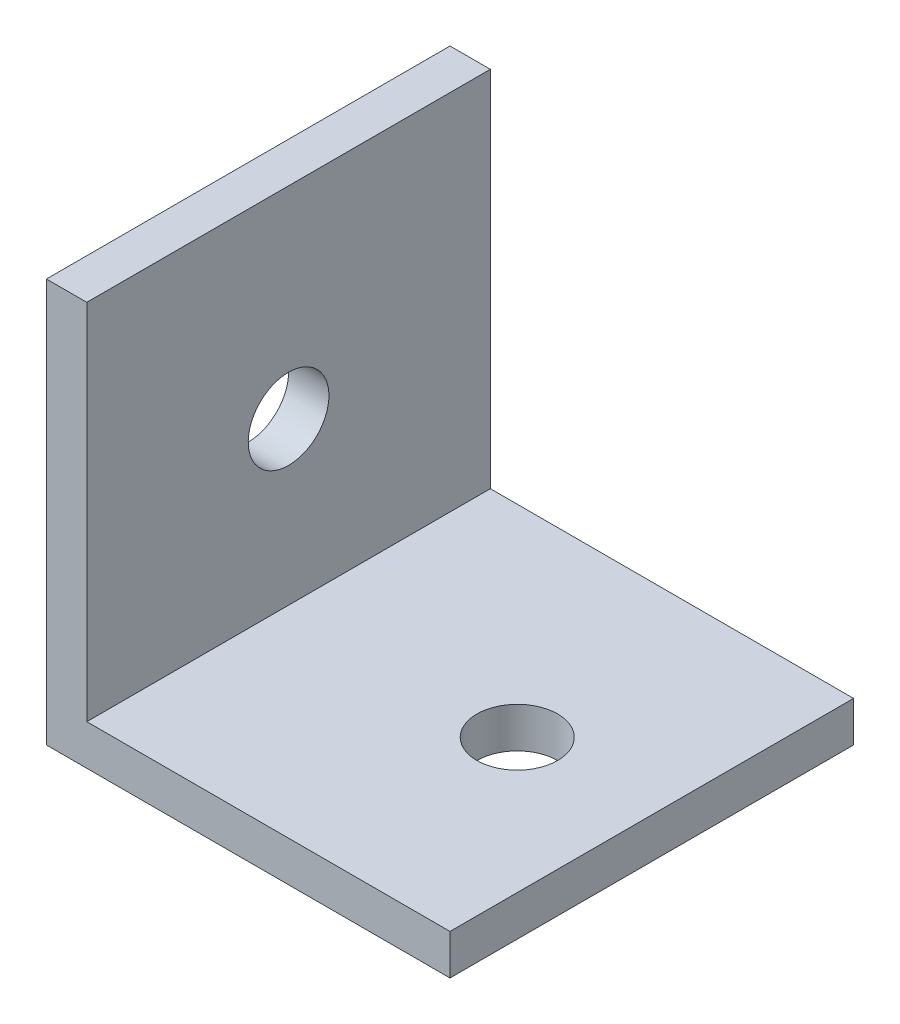
ISO-10303-21;
HEADER;
FILE_DESCRIPTION(('STEP AP214'),'2;1');
FILE_NAME('part.step','',(''),(''),'','','');
FILE_SCHEMA(('AUTOMOTIVE_DESIGN { 1 0 10303 214 1 1 1 1 }'));
ENDSEC;
DATA;
#1=APPLICATION_CONTEXT('core data for automotive mechanical design processes');
#2=APPLICATION_PROTOCOL_DEFINITION('international standard','automotive_design',2000,#1);
#3=PRODUCT_CONTEXT('',#1,'mechanical');
#4=PRODUCT('Part','Part','',(#3));
#5=PRODUCT_RELATED_PRODUCT_CATEGORY('part','',(#4));
#6=PRODUCT_DEFINITION_FORMATION('','',#4);
#7=PRODUCT_DEFINITION_CONTEXT('part definition',#1,'design');
#8=PRODUCT_DEFINITION('design','',#6,#7);
#9=PRODUCT_DEFINITION_SHAPE('','',#8);
#10=(LENGTH_UNIT() NAMED_UNIT(*) SI_UNIT(.MILLI.,.METRE.));
#11=(NAMED_UNIT(*) PLANE_ANGLE_UNIT() SI_UNIT($,.RADIAN.));
#12=(NAMED_UNIT(*) SI_UNIT($,.STERADIAN.) SOLID_ANGLE_UNIT());
#13=UNCERTAINTY_MEASURE_WITH_UNIT(LENGTH_MEASURE(1.E-05),#10,'distance_accuracy_value','');
#14=(GEOMETRIC_REPRESENTATION_CONTEXT(3) GLOBAL_UNCERTAINTY_ASSIGNED_CONTEXT((#13)) GLOBAL_UNIT_ASSIGNED_CONTEXT((#10,
#11,#12)) REPRESENTATION_CONTEXT('',''));
#15=CARTESIAN_POINT('',(0.,0.,0.));
#16=DIRECTION('',(0.,0.,1.));
#17=DIRECTION('',(1.,0.,0.));
#18=AXIS2_PLACEMENT_3D('',#15,#16,#17);
#19=CARTESIAN_POINT('',(-10.4957075667771,-0.631620023269676,15.));
#20=DIRECTION('',(0.,-1.,0.));
#21=DIRECTION('',(1.,0.,0.));
#22=AXIS2_PLACEMENT_3D('',#19,#20,#21);
#23=PLANE('',#22);
#24=DIRECTION('',(-1.,0.,0.));
#25=VECTOR('',#24,1.);
#26=CARTESIAN_POINT('',(-10.4957075667771,-0.631620023269676,0.));
#27=LINE('',#26,#25);
#28=CARTESIAN_POINT('',(-10.4957075667771,-0.631620023269676,0.));
#29=VERTEX_POINT('',#28);
#30=CARTESIAN_POINT('',(-11.9957075667771,-0.631620023269677,0.));
#31=VERTEX_POINT('',#30);
#32=EDGE_CURVE('E117',#29,#31,#27,.T.);
#33=ORIENTED_EDGE('',*,*,#32,.T.);
#34=DIRECTION('',(0.,0.,-1.));
#35=VECTOR('',#34,1.);
#36=CARTESIAN_POINT('',(-11.9957075667771,-0.631620023269677,15.));
#37=LINE('',#36,#35);
#38=CARTESIAN_POINT('',(-11.9957075667771,-0.631620023269677,15.));
#39=VERTEX_POINT('',#38);
#40=EDGE_CURVE('E11',#39,#31,#37,.T.);
#41=ORIENTED_EDGE('',*,*,#40,.F.);
#42=DIRECTION('',(-1.,0.,0.));
#43=VECTOR('',#42,1.);
#44=CARTESIAN_POINT('',(-10.4957075667771,-0.631620023269676,15.));
#45=LINE('',#44,#43);
#46=CARTESIAN_POINT('',(-10.4957075667771,-0.631620023269676,15.));
#47=VERTEX_POINT('',#46);
#48=EDGE_CURVE('E128',#47,#39,#45,.T.);
#49=ORIENTED_EDGE('',*,*,#48,.F.);
#50=DIRECTION('',(0.,0.,-1.));
#51=VECTOR('',#50,1.);
#52=CARTESIAN_POINT('',(-10.4957075667771,-0.631620023269676,15.));
#53=LINE('',#52,#51);
#54=EDGE_CURVE('E113',#47,#29,#53,.T.);
#55=ORIENTED_EDGE('',*,*,#54,.T.);
#56=EDGE_LOOP('',(#33,#41,#49,#55));
#57=FACE_BOUND('',#56,.T.);
#58=ADVANCED_FACE('F31',(#57),#23,.F.);
#59=CARTESIAN_POINT('',(-11.9957075667771,-0.631620023269677,15.));
#60=DIRECTION('',(1.,0.,0.));
#61=DIRECTION('',(0.,1.,0.));
#62=AXIS2_PLACEMENT_3D('',#59,#60,#61);
#63=PLANE('',#62);
#64=CARTESIAN_POINT('',(-11.9957075667771,-8.13162002326968,7.5));
#65=DIRECTION('',(-1.,0.,0.));
#66=DIRECTION('',(0.,-1.,0.));
#67=AXIS2_PLACEMENT_3D('',#64,#65,#66);
#68=CIRCLE('',#67,1.5);
#69=CARTESIAN_POINT('',(-11.9957075667771,-9.63162002326968,7.5));
#70=VERTEX_POINT('',#69);
#71=EDGE_CURVE('E134',#70,#70,#68,.T.);
#72=ORIENTED_EDGE('',*,*,#71,.F.);
#73=EDGE_LOOP('',(#72));
#74=FACE_BOUND('',#73,.T.);
#75=DIRECTION('',(0.,-1.,0.));
#76=VECTOR('',#75,1.);
#77=CARTESIAN_POINT('',(-11.9957075667771,-0.631620023269677,0.));
#78=LINE('',#77,#76);
#79=CARTESIAN_POINT('',(-11.9957075667771,-15.6316200232697,0.));
#80=VERTEX_POINT('',#79);
#81=EDGE_CURVE('E120',#31,#80,#78,.T.);
#82=ORIENTED_EDGE('',*,*,#81,.T.);
#83=DIRECTION('',(0.,0.,-1.));
#84=VECTOR('',#83,1.);
#85=CARTESIAN_POINT('',(-11.9957075667771,-15.6316200232697,15.));
#86=LINE('',#85,#84);
#87=CARTESIAN_POINT('',(-11.9957075667771,-15.6316200232697,15.));
#88=VERTEX_POINT('',#87);
#89=EDGE_CURVE('E40',#88,#80,#86,.T.);
#90=ORIENTED_EDGE('',*,*,#89,.F.);
#91=DIRECTION('',(0.,-1.,0.));
#92=VECTOR('',#91,1.);
#93=CARTESIAN_POINT('',(-11.9957075667771,-0.631620023269677,15.));
#94=LINE('',#93,#92);
#95=EDGE_CURVE('E86',#39,#88,#94,.T.);
#96=ORIENTED_EDGE('',*,*,#95,.F.);
#97=ORIENTED_EDGE('',*,*,#40,.T.);
#98=EDGE_LOOP('',(#82,#90,#96,#97));
#99=FACE_BOUND('',#98,.T.);
#100=ADVANCED_FACE('F148',(#74,#99),#63,.F.);
#101=CARTESIAN_POINT('',(-11.9957075667771,-15.6316200232697,15.));
#102=DIRECTION('',(0.,1.,0.));
#103=DIRECTION('',(0.,0.,1.));
#104=AXIS2_PLACEMENT_3D('',#101,#102,#103);
#105=PLANE('',#104);
#106=CARTESIAN_POINT('',(-1.99570756677709,-15.6316200232697,7.5));
#107=DIRECTION('',(0.,-1.,0.));
#108=DIRECTION('',(0.,0.,-1.));
#109=AXIS2_PLACEMENT_3D('',#106,#107,#108);
#110=CIRCLE('',#109,1.5);
#111=CARTESIAN_POINT('',(-1.99570756677709,-15.6316200232697,6.));
#112=VERTEX_POINT('',#111);
#113=EDGE_CURVE('E142',#112,#112,#110,.T.);
#114=ORIENTED_EDGE('',*,*,#113,.F.);
#115=EDGE_LOOP('',(#114));
#116=FACE_BOUND('',#115,.T.);
#117=DIRECTION('',(1.,0.,0.));
#118=VECTOR('',#117,1.);
#119=CARTESIAN_POINT('',(-11.9957075667771,-15.6316200232697,0.));
#120=LINE('',#119,#118);
#121=CARTESIAN_POINT('',(3.00429243322291,-15.6316200232697,0.));
#122=VERTEX_POINT('',#121);
#123=EDGE_CURVE('E123',#80,#122,#120,.T.);
#124=ORIENTED_EDGE('',*,*,#123,.T.);
#125=DIRECTION('',(0.,0.,-1.));
#126=VECTOR('',#125,1.);
#127=CARTESIAN_POINT('',(3.00429243322291,-15.6316200232697,15.));
#128=LINE('',#127,#126);
#129=CARTESIAN_POINT('',(3.00429243322291,-15.6316200232697,15.));
#130=VERTEX_POINT('',#129);
#131=EDGE_CURVE('E108',#130,#122,#128,.T.);
#132=ORIENTED_EDGE('',*,*,#131,.F.);
#133=DIRECTION('',(1.,0.,0.));
#134=VECTOR('',#133,1.);
#135=CARTESIAN_POINT('',(-11.9957075667771,-15.6316200232697,15.));
#136=LINE('',#135,#134);
#137=EDGE_CURVE('E99',#88,#130,#136,.T.);
#138=ORIENTED_EDGE('',*,*,#137,.F.);
#139=ORIENTED_EDGE('',*,*,#89,.T.);
#140=EDGE_LOOP('',(#124,#132,#138,#139));
#141=FACE_BOUND('',#140,.T.);
#142=ADVANCED_FACE('F151',(#116,#141),#105,.F.);
#143=CARTESIAN_POINT('',(3.00429243322291,-15.6316200232697,15.));
#144=DIRECTION('',(-1.,0.,0.));
#145=DIRECTION('',(0.,0.,1.));
#146=AXIS2_PLACEMENT_3D('',#143,#144,#145);
#147=PLANE('',#146);
#148=DIRECTION('',(0.,1.,0.));
#149=VECTOR('',#148,1.);
#150=CARTESIAN_POINT('',(3.00429243322291,-15.6316200232697,0.));
#151=LINE('',#150,#149);
#152=CARTESIAN_POINT('',(3.00429243322291,-14.1316200232697,0.));
#153=VERTEX_POINT('',#152);
#154=EDGE_CURVE('E107',#122,#153,#151,.T.);
#155=ORIENTED_EDGE('',*,*,#154,.T.);
#156=DIRECTION('',(0.,0.,-1.));
#157=VECTOR('',#156,1.);
#158=CARTESIAN_POINT('',(3.00429243322291,-14.1316200232697,15.));
#159=LINE('',#158,#157);
#160=CARTESIAN_POINT('',(3.00429243322291,-14.1316200232697,15.));
#161=VERTEX_POINT('',#160);
#162=EDGE_CURVE('E104',#161,#153,#159,.T.);
#163=ORIENTED_EDGE('',*,*,#162,.F.);
#164=DIRECTION('',(0.,1.,0.));
#165=VECTOR('',#164,1.);
#166=CARTESIAN_POINT('',(3.00429243322291,-15.6316200232697,15.));
#167=LINE('',#166,#165);
#168=EDGE_CURVE('E93',#130,#161,#167,.T.);
#169=ORIENTED_EDGE('',*,*,#168,.F.);
#170=ORIENTED_EDGE('',*,*,#131,.T.);
#171=EDGE_LOOP('',(#155,#163,#169,#170));
#172=FACE_BOUND('',#171,.T.);
#173=ADVANCED_FACE('F105',(#172),#147,.F.);
#174=CARTESIAN_POINT('',(3.00429243322291,-14.1316200232697,15.));
#175=DIRECTION('',(0.,-1.,0.));
#176=DIRECTION('',(1.,0.,0.));
#177=AXIS2_PLACEMENT_3D('',#174,#175,#176);
#178=PLANE('',#177);
#179=CARTESIAN_POINT('',(-1.99570756677709,-14.1316200232697,7.5));
#180=DIRECTION('',(0.,-1.,0.));
#181=DIRECTION('',(1.,0.,0.));
#182=AXIS2_PLACEMENT_3D('',#179,#180,#181);
#183=CIRCLE('',#182,1.5);
#184=CARTESIAN_POINT('',(-0.495707566777091,-14.1316200232697,7.5));
#185=VERTEX_POINT('',#184);
#186=EDGE_CURVE('E34',#185,#185,#183,.T.);
#187=ORIENTED_EDGE('',*,*,#186,.T.);
#188=EDGE_LOOP('',(#187));
#189=FACE_BOUND('',#188,.T.);
#190=DIRECTION('',(-1.,0.,0.));
#191=VECTOR('',#190,1.);
#192=CARTESIAN_POINT('',(3.00429243322291,-14.1316200232697,0.));
#193=LINE('',#192,#191);
#194=CARTESIAN_POINT('',(-10.4957075667771,-14.1316200232697,0.));
#195=VERTEX_POINT('',#194);
#196=EDGE_CURVE('E72',#153,#195,#193,.T.);
#197=ORIENTED_EDGE('',*,*,#196,.T.);
#198=DIRECTION('',(0.,0.,-1.));
#199=VECTOR('',#198,1.);
#200=CARTESIAN_POINT('',(-10.4957075667771,-14.1316200232697,15.));
#201=LINE('',#200,#199);
#202=CARTESIAN_POINT('',(-10.4957075667771,-14.1316200232697,15.));
#203=VERTEX_POINT('',#202);
#204=EDGE_CURVE('E109',#203,#195,#201,.T.);
#205=ORIENTED_EDGE('',*,*,#204,.F.);
#206=DIRECTION('',(-1.,0.,0.));
#207=VECTOR('',#206,1.);
#208=CARTESIAN_POINT('',(3.00429243322291,-14.1316200232697,15.));
#209=LINE('',#208,#207);
#210=EDGE_CURVE('E97',#161,#203,#209,.T.);
#211=ORIENTED_EDGE('',*,*,#210,.F.);
#212=ORIENTED_EDGE('',*,*,#162,.T.);
#213=EDGE_LOOP('',(#197,#205,#211,#212));
#214=FACE_BOUND('',#213,.T.);
#215=ADVANCED_FACE('F111',(#189,#214),#178,.F.);
#216=CARTESIAN_POINT('',(-10.4957075667771,-14.1316200232697,15.));
#217=DIRECTION('',(-1.,0.,0.));
#218=DIRECTION('',(0.,-1.,0.));
#219=AXIS2_PLACEMENT_3D('',#216,#217,#218);
#220=PLANE('',#219);
#221=CARTESIAN_POINT('',(-10.4957075667771,-8.13162002326968,7.5));
#222=DIRECTION('',(-1.,0.,0.));
#223=DIRECTION('',(0.,-1.,0.));
#224=AXIS2_PLACEMENT_3D('',#221,#222,#223);
#225=CIRCLE('',#224,1.5);
#226=CARTESIAN_POINT('',(-10.4957075667771,-9.63162002326968,7.5));
#227=VERTEX_POINT('',#226);
#228=EDGE_CURVE('E121',#227,#227,#225,.T.);
#229=ORIENTED_EDGE('',*,*,#228,.T.);
#230=EDGE_LOOP('',(#229));
#231=FACE_BOUND('',#230,.T.);
#232=DIRECTION('',(0.,1.,0.));
#233=VECTOR('',#232,1.);
#234=CARTESIAN_POINT('',(-10.4957075667771,-14.1316200232697,0.));
#235=LINE('',#234,#233);
#236=EDGE_CURVE('E78',#195,#29,#235,.T.);
#237=ORIENTED_EDGE('',*,*,#236,.T.);
#238=ORIENTED_EDGE('',*,*,#54,.F.);
#239=DIRECTION('',(0.,1.,0.));
#240=VECTOR('',#239,1.);
#241=CARTESIAN_POINT('',(-10.4957075667771,-14.1316200232697,15.));
#242=LINE('',#241,#240);
#243=EDGE_CURVE('E49',#203,#47,#242,.T.);
#244=ORIENTED_EDGE('',*,*,#243,.F.);
#245=ORIENTED_EDGE('',*,*,#204,.T.);
#246=EDGE_LOOP('',(#237,#238,#244,#245));
#247=FACE_BOUND('',#246,.T.);
#248=ADVANCED_FACE('F156',(#231,#247),#220,.F.);
#249=CARTESIAN_POINT('',(-11.9957075667771,-0.631620023269677,15.));
#250=DIRECTION('',(0.,0.,1.));
#251=DIRECTION('',(1.,0.,0.));
#252=AXIS2_PLACEMENT_3D('',#249,#250,#251);
#253=PLANE('',#252);
#254=ORIENTED_EDGE('',*,*,#48,.T.);
#255=ORIENTED_EDGE('',*,*,#95,.T.);
#256=ORIENTED_EDGE('',*,*,#137,.T.);
#257=ORIENTED_EDGE('',*,*,#168,.T.);
#258=ORIENTED_EDGE('',*,*,#210,.T.);
#259=ORIENTED_EDGE('',*,*,#243,.T.);
#260=EDGE_LOOP('',(#254,#255,#256,#257,#258,#259));
#261=FACE_BOUND('',#260,.T.);
#262=ADVANCED_FACE('F95',(#261),#253,.T.);
#263=CARTESIAN_POINT('',(-11.9957075667771,-0.631620023269677,0.));
#264=DIRECTION('',(0.,0.,1.));
#265=DIRECTION('',(1.,0.,0.));
#266=AXIS2_PLACEMENT_3D('',#263,#264,#265);
#267=PLANE('',#266);
#268=ORIENTED_EDGE('',*,*,#32,.F.);
#269=ORIENTED_EDGE('',*,*,#236,.F.);
#270=ORIENTED_EDGE('',*,*,#196,.F.);
#271=ORIENTED_EDGE('',*,*,#154,.F.);
#272=ORIENTED_EDGE('',*,*,#123,.F.);
#273=ORIENTED_EDGE('',*,*,#81,.F.);
#274=EDGE_LOOP('',(#268,#269,#270,#271,#272,#273));
#275=FACE_BOUND('',#274,.T.);
#276=ADVANCED_FACE('F154',(#275),#267,.F.);
#277=CARTESIAN_POINT('',(3.00429243322291,-8.13162002326968,7.5));
#278=DIRECTION('',(-1.,0.,0.));
#279=DIRECTION('',(0.,-1.,0.));
#280=AXIS2_PLACEMENT_3D('',#277,#278,#279);
#281=CYLINDRICAL_SURFACE('',#280,1.5);
#282=ORIENTED_EDGE('',*,*,#71,.T.);
#283=EDGE_LOOP('',(#282));
#284=FACE_BOUND('',#283,.T.);
#285=ORIENTED_EDGE('',*,*,#228,.F.);
#286=EDGE_LOOP('',(#285));
#287=FACE_BOUND('',#286,.T.);
#288=ADVANCED_FACE('F201',(#284,#287),#281,.F.);
#289=CARTESIAN_POINT('',(-1.99570756677709,-0.631620023269677,7.5));
#290=DIRECTION('',(0.,-1.,0.));
#291=DIRECTION('',(0.,0.,-1.));
#292=AXIS2_PLACEMENT_3D('',#289,#290,#291);
#293=CYLINDRICAL_SURFACE('',#292,1.5);
#294=ORIENTED_EDGE('',*,*,#113,.T.);
#295=EDGE_LOOP('',(#294));
#296=FACE_BOUND('',#295,.T.);
#297=ORIENTED_EDGE('',*,*,#186,.F.);
#298=EDGE_LOOP('',(#297));
#299=FACE_BOUND('',#298,.T.);
#300=ADVANCED_FACE('F197',(#296,#299),#293,.F.);
#301=CLOSED_SHELL('',(#58,#100,#142,#173,#215,#248,#262,#276,#288,#300));
#302=MANIFOLD_SOLID_BREP('B2',#301);
#303=ADVANCED_BREP_SHAPE_REPRESENTATION('',(#18,#302),#14);
#304=SHAPE_DEFINITION_REPRESENTATION(#9,#303);
ENDSEC;
END-ISO-10303-21;
